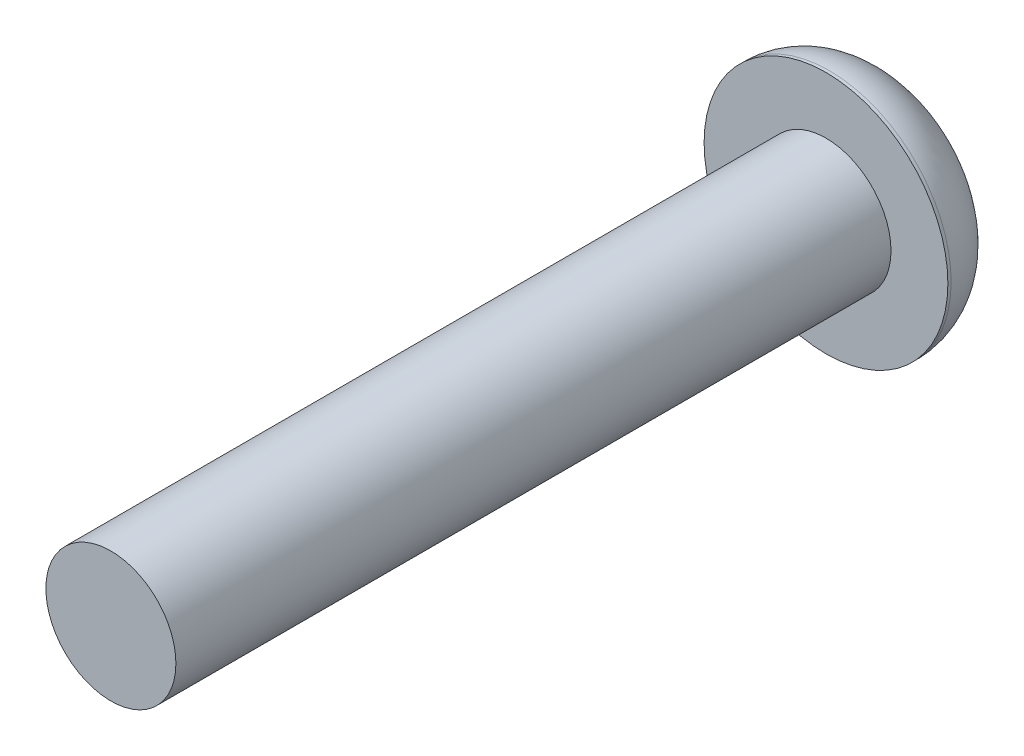
ISO-10303-21;
HEADER;
FILE_DESCRIPTION(('STEP AP214'),'2;1');
FILE_NAME('part.step','',(''),(''),'','','');
FILE_SCHEMA(('AUTOMOTIVE_DESIGN { 1 0 10303 214 1 1 1 1 }'));
ENDSEC;
DATA;
#1=APPLICATION_CONTEXT('core data for automotive mechanical design processes');
#2=APPLICATION_PROTOCOL_DEFINITION('international standard','automotive_design',2000,#1);
#3=PRODUCT_CONTEXT('',#1,'mechanical');
#4=PRODUCT('Part','Part','',(#3));
#5=PRODUCT_RELATED_PRODUCT_CATEGORY('part','',(#4));
#6=PRODUCT_DEFINITION_FORMATION('','',#4);
#7=PRODUCT_DEFINITION_CONTEXT('part definition',#1,'design');
#8=PRODUCT_DEFINITION('design','',#6,#7);
#9=PRODUCT_DEFINITION_SHAPE('','',#8);
#10=(LENGTH_UNIT() NAMED_UNIT(*) SI_UNIT(.MILLI.,.METRE.));
#11=(NAMED_UNIT(*) PLANE_ANGLE_UNIT() SI_UNIT($,.RADIAN.));
#12=(NAMED_UNIT(*) SI_UNIT($,.STERADIAN.) SOLID_ANGLE_UNIT());
#13=UNCERTAINTY_MEASURE_WITH_UNIT(LENGTH_MEASURE(1.E-05),#10,'distance_accuracy_value','');
#14=(GEOMETRIC_REPRESENTATION_CONTEXT(3) GLOBAL_UNCERTAINTY_ASSIGNED_CONTEXT((#13)) GLOBAL_UNIT_ASSIGNED_CONTEXT((#10,
#11,#12)) REPRESENTATION_CONTEXT('',''));
#15=CARTESIAN_POINT('',(0.,0.,0.));
#16=DIRECTION('',(0.,0.,1.));
#17=DIRECTION('',(1.,0.,0.));
#18=AXIS2_PLACEMENT_3D('',#15,#16,#17);
#19=CARTESIAN_POINT('',(0.,0.,22.));
#20=DIRECTION('',(0.,0.,-1.));
#21=DIRECTION('',(-1.,0.,0.));
#22=AXIS2_PLACEMENT_3D('',#19,#20,#21);
#23=CYLINDRICAL_SURFACE('',#22,2.);
#24=CARTESIAN_POINT('',(0.,0.,22.));
#25=DIRECTION('',(0.,0.,1.));
#26=DIRECTION('',(1.,0.,0.));
#27=AXIS2_PLACEMENT_3D('',#24,#25,#26);
#28=CIRCLE('',#27,2.);
#29=CARTESIAN_POINT('',(2.,0.,22.));
#30=VERTEX_POINT('',#29);
#31=EDGE_CURVE('E50',#30,#30,#28,.T.);
#32=ORIENTED_EDGE('',*,*,#31,.F.);
#33=EDGE_LOOP('',(#32));
#34=FACE_BOUND('',#33,.T.);
#35=CARTESIAN_POINT('',(0.,0.,0.));
#36=DIRECTION('',(0.,0.,1.));
#37=DIRECTION('',(1.,0.,0.));
#38=AXIS2_PLACEMENT_3D('',#35,#36,#37);
#39=CIRCLE('',#38,2.);
#40=CARTESIAN_POINT('',(2.,0.,0.));
#41=VERTEX_POINT('',#40);
#42=EDGE_CURVE('E55',#41,#41,#39,.T.);
#43=ORIENTED_EDGE('',*,*,#42,.T.);
#44=EDGE_LOOP('',(#43));
#45=FACE_BOUND('',#44,.T.);
#46=ADVANCED_FACE('F37',(#34,#45),#23,.T.);
#47=CARTESIAN_POINT('',(0.,0.,22.));
#48=DIRECTION('',(0.,0.,1.));
#49=DIRECTION('',(1.,0.,0.));
#50=AXIS2_PLACEMENT_3D('',#47,#48,#49);
#51=PLANE('',#50);
#52=ORIENTED_EDGE('',*,*,#31,.T.);
#53=EDGE_LOOP('',(#52));
#54=FACE_BOUND('',#53,.T.);
#55=ADVANCED_FACE('F82',(#54),#51,.T.);
#56=CARTESIAN_POINT('',(0.,0.,-2.1));
#57=DIRECTION('',(0.,0.,1.));
#58=DIRECTION('',(1.,0.,0.));
#59=AXIS2_PLACEMENT_3D('',#56,#57,#58);
#60=CYLINDRICAL_SURFACE('',#59,3.75);
#61=CARTESIAN_POINT('',(0.,0.,-0.1));
#62=DIRECTION('',(0.,0.,-1.));
#63=DIRECTION('',(-1.,0.,0.));
#64=AXIS2_PLACEMENT_3D('',#61,#62,#63);
#65=CIRCLE('',#64,3.75);
#66=CARTESIAN_POINT('',(-3.75,0.,-0.1));
#67=VERTEX_POINT('',#66);
#68=EDGE_CURVE('E10',#67,#67,#65,.F.);
#69=ORIENTED_EDGE('',*,*,#68,.T.);
#70=EDGE_LOOP('',(#69));
#71=FACE_BOUND('',#70,.T.);
#72=CARTESIAN_POINT('',(0.,0.,0.));
#73=DIRECTION('',(0.,0.,-1.));
#74=DIRECTION('',(-1.,0.,0.));
#75=AXIS2_PLACEMENT_3D('',#72,#73,#74);
#76=CIRCLE('',#75,3.75);
#77=CARTESIAN_POINT('',(-3.75,0.,0.));
#78=VERTEX_POINT('',#77);
#79=EDGE_CURVE('E60',#78,#78,#76,.T.);
#80=ORIENTED_EDGE('',*,*,#79,.T.);
#81=EDGE_LOOP('',(#80));
#82=FACE_BOUND('',#81,.T.);
#83=ADVANCED_FACE('F66',(#71,#82),#60,.T.);
#84=CARTESIAN_POINT('',(0.,0.,-2.1));
#85=DIRECTION('',(0.,0.,-1.));
#86=DIRECTION('',(-1.,0.,0.));
#87=AXIS2_PLACEMENT_3D('',#84,#85,#86);
#88=PLANE('',#87);
#89=CARTESIAN_POINT('',(0.,0.,-2.1));
#90=DIRECTION('',(0.,0.,-1.));
#91=DIRECTION('',(-1.,0.,0.));
#92=AXIS2_PLACEMENT_3D('',#89,#90,#91);
#93=CIRCLE('',#92,1.75);
#94=CARTESIAN_POINT('',(-1.75,0.,-2.1));
#95=VERTEX_POINT('',#94);
#96=EDGE_CURVE('E45',#95,#95,#93,.T.);
#97=ORIENTED_EDGE('',*,*,#96,.T.);
#98=EDGE_LOOP('',(#97));
#99=FACE_BOUND('',#98,.T.);
#100=ADVANCED_FACE('F70',(#99),#88,.T.);
#101=CARTESIAN_POINT('',(0.,0.,0.));
#102=DIRECTION('',(0.,0.,-1.));
#103=DIRECTION('',(-1.,0.,0.));
#104=AXIS2_PLACEMENT_3D('',#101,#102,#103);
#105=PLANE('',#104);
#106=ORIENTED_EDGE('',*,*,#42,.F.);
#107=EDGE_LOOP('',(#106));
#108=FACE_BOUND('',#107,.T.);
#109=ORIENTED_EDGE('',*,*,#79,.F.);
#110=EDGE_LOOP('',(#109));
#111=FACE_BOUND('',#110,.T.);
#112=ADVANCED_FACE('F68',(#108,#111),#105,.F.);
#113=CARTESIAN_POINT('',(0.,0.,-0.1));
#114=DIRECTION('',(0.,0.,-1.));
#115=DIRECTION('',(-1.,0.,0.));
#116=AXIS2_PLACEMENT_3D('',#113,#114,#115);
#117=DEGENERATE_TOROIDAL_SURFACE('',#116,1.75,2.,.T.);
#118=ORIENTED_EDGE('',*,*,#68,.F.);
#119=EDGE_LOOP('',(#118));
#120=FACE_BOUND('',#119,.T.);
#121=ORIENTED_EDGE('',*,*,#96,.F.);
#122=EDGE_LOOP('',(#121));
#123=FACE_BOUND('',#122,.T.);
#124=ADVANCED_FACE('F39',(#120,#123),#117,.T.);
#125=CLOSED_SHELL('',(#46,#55,#83,#100,#112,#124));
#126=MANIFOLD_SOLID_BREP('B2',#125);
#127=ADVANCED_BREP_SHAPE_REPRESENTATION('',(#18,#126),#14);
#128=SHAPE_DEFINITION_REPRESENTATION(#9,#127);
ENDSEC;
END-ISO-10303-21;
